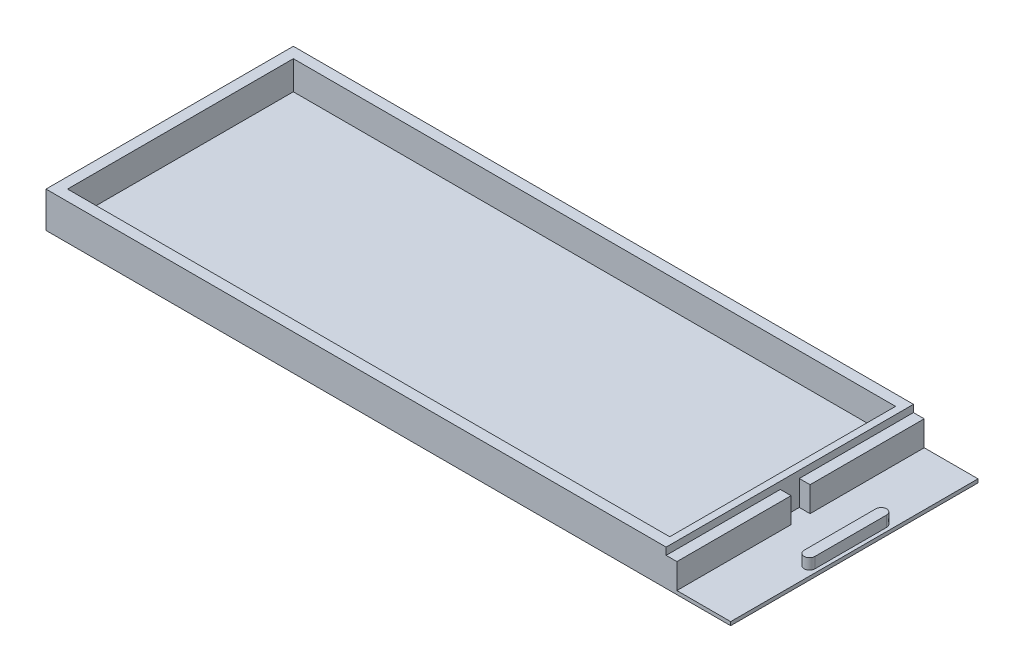
ISO-10303-21;
HEADER;
FILE_DESCRIPTION(('STEP AP214'),'2;1');
FILE_NAME('part.step','',(''),(''),'','','');
FILE_SCHEMA(('AUTOMOTIVE_DESIGN { 1 0 10303 214 1 1 1 1 }'));
ENDSEC;
DATA;
#1=APPLICATION_CONTEXT('core data for automotive mechanical design processes');
#2=APPLICATION_PROTOCOL_DEFINITION('international standard','automotive_design',2000,#1);
#3=PRODUCT_CONTEXT('',#1,'mechanical');
#4=PRODUCT('Part','Part','',(#3));
#5=PRODUCT_RELATED_PRODUCT_CATEGORY('part','',(#4));
#6=PRODUCT_DEFINITION_FORMATION('','',#4);
#7=PRODUCT_DEFINITION_CONTEXT('part definition',#1,'design');
#8=PRODUCT_DEFINITION('design','',#6,#7);
#9=PRODUCT_DEFINITION_SHAPE('','',#8);
#10=(LENGTH_UNIT() NAMED_UNIT(*) SI_UNIT(.MILLI.,.METRE.));
#11=(NAMED_UNIT(*) PLANE_ANGLE_UNIT() SI_UNIT($,.RADIAN.));
#12=(NAMED_UNIT(*) SI_UNIT($,.STERADIAN.) SOLID_ANGLE_UNIT());
#13=UNCERTAINTY_MEASURE_WITH_UNIT(LENGTH_MEASURE(1.E-05),#10,'distance_accuracy_value','');
#14=(GEOMETRIC_REPRESENTATION_CONTEXT(3) GLOBAL_UNCERTAINTY_ASSIGNED_CONTEXT((#13)) GLOBAL_UNIT_ASSIGNED_CONTEXT((#10,
#11,#12)) REPRESENTATION_CONTEXT('',''));
#15=CARTESIAN_POINT('',(0.,0.,0.));
#16=DIRECTION('',(0.,0.,1.));
#17=DIRECTION('',(1.,0.,0.));
#18=AXIS2_PLACEMENT_3D('',#15,#16,#17);
#19=CARTESIAN_POINT('',(104.,1.,34.5));
#20=DIRECTION('',(0.,-1.,0.));
#21=DIRECTION('',(0.,0.,-1.));
#22=AXIS2_PLACEMENT_3D('',#19,#20,#21);
#23=PLANE('',#22);
#24=DIRECTION('',(0.,0.,1.));
#25=VECTOR('',#24,1.);
#26=CARTESIAN_POINT('',(89.,1.,34.5));
#27=LINE('',#26,#25);
#28=CARTESIAN_POINT('',(89.,1.,-34.5));
#29=VERTEX_POINT('',#28);
#30=CARTESIAN_POINT('',(89.,1.,-2.65000000000001));
#31=VERTEX_POINT('',#30);
#32=EDGE_CURVE('E303',#29,#31,#27,.T.);
#33=ORIENTED_EDGE('',*,*,#32,.T.);
#34=DIRECTION('',(1.,0.,0.));
#35=VECTOR('',#34,1.);
#36=CARTESIAN_POINT('',(86.,1.,-2.65000000000001));
#37=LINE('',#36,#35);
#38=CARTESIAN_POINT('',(86.,1.,-2.65000000000001));
#39=VERTEX_POINT('',#38);
#40=EDGE_CURVE('E256',#39,#31,#37,.T.);
#41=ORIENTED_EDGE('',*,*,#40,.F.);
#42=DIRECTION('',(0.,0.,-1.));
#43=VECTOR('',#42,1.);
#44=CARTESIAN_POINT('',(86.,1.,2.65));
#45=LINE('',#44,#43);
#46=CARTESIAN_POINT('',(86.,1.,2.65));
#47=VERTEX_POINT('',#46);
#48=EDGE_CURVE('E248',#47,#39,#45,.T.);
#49=ORIENTED_EDGE('',*,*,#48,.F.);
#50=DIRECTION('',(1.,0.,0.));
#51=VECTOR('',#50,1.);
#52=CARTESIAN_POINT('',(86.,1.,2.65));
#53=LINE('',#52,#51);
#54=CARTESIAN_POINT('',(89.,1.,2.65));
#55=VERTEX_POINT('',#54);
#56=EDGE_CURVE('E260',#47,#55,#53,.T.);
#57=ORIENTED_EDGE('',*,*,#56,.T.);
#58=CARTESIAN_POINT('',(89.,1.,34.5));
#59=VERTEX_POINT('',#58);
#60=EDGE_CURVE('E289',#55,#59,#27,.T.);
#61=ORIENTED_EDGE('',*,*,#60,.T.);
#62=DIRECTION('',(-1.,0.,0.));
#63=VECTOR('',#62,1.);
#64=CARTESIAN_POINT('',(104.,1.,34.5));
#65=LINE('',#64,#63);
#66=CARTESIAN_POINT('',(104.,1.,34.5));
#67=VERTEX_POINT('',#66);
#68=EDGE_CURVE('E313',#67,#59,#65,.T.);
#69=ORIENTED_EDGE('',*,*,#68,.F.);
#70=DIRECTION('',(0.,0.,1.));
#71=VECTOR('',#70,1.);
#72=CARTESIAN_POINT('',(104.,1.,34.5));
#73=LINE('',#72,#71);
#74=CARTESIAN_POINT('',(104.,1.,-34.5));
#75=VERTEX_POINT('',#74);
#76=EDGE_CURVE('E306',#75,#67,#73,.T.);
#77=ORIENTED_EDGE('',*,*,#76,.F.);
#78=DIRECTION('',(-1.,0.,0.));
#79=VECTOR('',#78,1.);
#80=CARTESIAN_POINT('',(104.,1.,-34.5));
#81=LINE('',#80,#79);
#82=EDGE_CURVE('E320',#75,#29,#81,.T.);
#83=ORIENTED_EDGE('',*,*,#82,.T.);
#84=EDGE_LOOP('',(#33,#41,#49,#57,#61,#69,#77,#83));
#85=FACE_BOUND('',#84,.T.);
#86=CARTESIAN_POINT('',(101.5,1.,-10.));
#87=DIRECTION('',(0.,1.,0.));
#88=DIRECTION('',(0.,0.,1.));
#89=AXIS2_PLACEMENT_3D('',#86,#87,#88);
#90=CIRCLE('',#89,1.50000000000002);
#91=CARTESIAN_POINT('',(103.,1.,-10.));
#92=VERTEX_POINT('',#91);
#93=CARTESIAN_POINT('',(100.,1.,-9.99999999999999));
#94=VERTEX_POINT('',#93);
#95=EDGE_CURVE('E229',#92,#94,#90,.T.);
#96=ORIENTED_EDGE('',*,*,#95,.F.);
#97=DIRECTION('',(0.,0.,-1.));
#98=VECTOR('',#97,1.);
#99=CARTESIAN_POINT('',(103.,1.,-10.));
#100=LINE('',#99,#98);
#101=CARTESIAN_POINT('',(103.,1.,10.));
#102=VERTEX_POINT('',#101);
#103=EDGE_CURVE('E226',#102,#92,#100,.T.);
#104=ORIENTED_EDGE('',*,*,#103,.F.);
#105=CARTESIAN_POINT('',(101.5,1.,10.));
#106=DIRECTION('',(0.,1.,0.));
#107=DIRECTION('',(0.,0.,1.));
#108=AXIS2_PLACEMENT_3D('',#105,#106,#107);
#109=CIRCLE('',#108,1.50000000000002);
#110=CARTESIAN_POINT('',(100.,1.,10.));
#111=VERTEX_POINT('',#110);
#112=EDGE_CURVE('E66',#111,#102,#109,.T.);
#113=ORIENTED_EDGE('',*,*,#112,.F.);
#114=DIRECTION('',(0.,0.,1.));
#115=VECTOR('',#114,1.);
#116=CARTESIAN_POINT('',(100.,1.,-10.));
#117=LINE('',#116,#115);
#118=EDGE_CURVE('E61',#94,#111,#117,.T.);
#119=ORIENTED_EDGE('',*,*,#118,.F.);
#120=EDGE_LOOP('',(#96,#104,#113,#119));
#121=FACE_BOUND('',#120,.T.);
#122=ADVANCED_FACE('F45',(#85,#121),#23,.F.);
#123=CARTESIAN_POINT('',(89.,0.,-6.5));
#124=DIRECTION('',(-1.,0.,0.));
#125=DIRECTION('',(0.,0.,1.));
#126=AXIS2_PLACEMENT_3D('',#123,#124,#125);
#127=PLANE('',#126);
#128=DIRECTION('',(0.,0.,1.));
#129=VECTOR('',#128,1.);
#130=CARTESIAN_POINT('',(89.,8.,-34.5));
#131=LINE('',#130,#129);
#132=CARTESIAN_POINT('',(89.,8.,-34.5));
#133=VERTEX_POINT('',#132);
#134=CARTESIAN_POINT('',(89.,7.99999999999999,-2.65));
#135=VERTEX_POINT('',#134);
#136=EDGE_CURVE('E285',#133,#135,#131,.T.);
#137=ORIENTED_EDGE('',*,*,#136,.T.);
#138=DIRECTION('',(0.,1.,0.));
#139=VECTOR('',#138,1.);
#140=CARTESIAN_POINT('',(89.,1.,-2.65000000000001));
#141=LINE('',#140,#139);
#142=EDGE_CURVE('E231',#31,#135,#141,.T.);
#143=ORIENTED_EDGE('',*,*,#142,.F.);
#144=ORIENTED_EDGE('',*,*,#32,.F.);
#145=DIRECTION('',(0.,1.,0.));
#146=VECTOR('',#145,1.);
#147=CARTESIAN_POINT('',(89.,8.,-34.5));
#148=LINE('',#147,#146);
#149=EDGE_CURVE('E365',#29,#133,#148,.T.);
#150=ORIENTED_EDGE('',*,*,#149,.T.);
#151=EDGE_LOOP('',(#137,#143,#144,#150));
#152=FACE_BOUND('',#151,.T.);
#153=ADVANCED_FACE('F505',(#152),#127,.F.);
#154=CARTESIAN_POINT('',(89.,8.,-34.5));
#155=DIRECTION('',(0.,-1.,0.));
#156=DIRECTION('',(0.,0.,-1.));
#157=AXIS2_PLACEMENT_3D('',#154,#155,#156);
#158=PLANE('',#157);
#159=DIRECTION('',(0.,0.,1.));
#160=VECTOR('',#159,1.);
#161=CARTESIAN_POINT('',(86.,8.,-34.5));
#162=LINE('',#161,#160);
#163=CARTESIAN_POINT('',(86.,8.,-34.5));
#164=VERTEX_POINT('',#163);
#165=CARTESIAN_POINT('',(86.,8.,-2.65));
#166=VERTEX_POINT('',#165);
#167=EDGE_CURVE('E291',#164,#166,#162,.T.);
#168=ORIENTED_EDGE('',*,*,#167,.T.);
#169=DIRECTION('',(1.,0.,0.));
#170=VECTOR('',#169,1.);
#171=CARTESIAN_POINT('',(86.,7.99999999999999,-2.65));
#172=LINE('',#171,#170);
#173=EDGE_CURVE('E251',#166,#135,#172,.T.);
#174=ORIENTED_EDGE('',*,*,#173,.T.);
#175=ORIENTED_EDGE('',*,*,#136,.F.);
#176=DIRECTION('',(1.,0.,0.));
#177=VECTOR('',#176,1.);
#178=CARTESIAN_POINT('',(89.,8.,-34.5));
#179=LINE('',#178,#177);
#180=EDGE_CURVE('E273',#164,#133,#179,.T.);
#181=ORIENTED_EDGE('',*,*,#180,.F.);
#182=EDGE_LOOP('',(#168,#174,#175,#181));
#183=FACE_BOUND('',#182,.T.);
#184=ADVANCED_FACE('F511',(#183),#158,.F.);
#185=ORIENTED_EDGE('',*,*,#60,.F.);
#186=DIRECTION('',(0.,-1.,0.));
#187=VECTOR('',#186,1.);
#188=CARTESIAN_POINT('',(89.,7.99999999999999,2.65));
#189=LINE('',#188,#187);
#190=CARTESIAN_POINT('',(89.,7.99999999999999,2.65));
#191=VERTEX_POINT('',#190);
#192=EDGE_CURVE('E235',#191,#55,#189,.T.);
#193=ORIENTED_EDGE('',*,*,#192,.F.);
#194=CARTESIAN_POINT('',(89.,8.,34.5));
#195=VERTEX_POINT('',#194);
#196=EDGE_CURVE('E290',#191,#195,#131,.T.);
#197=ORIENTED_EDGE('',*,*,#196,.T.);
#198=DIRECTION('',(0.,1.,0.));
#199=VECTOR('',#198,1.);
#200=CARTESIAN_POINT('',(89.,8.,34.5));
#201=LINE('',#200,#199);
#202=EDGE_CURVE('E369',#59,#195,#201,.T.);
#203=ORIENTED_EDGE('',*,*,#202,.F.);
#204=EDGE_LOOP('',(#185,#193,#197,#203));
#205=FACE_BOUND('',#204,.T.);
#206=ADVANCED_FACE('F465',(#205),#127,.F.);
#207=CARTESIAN_POINT('',(-87.,10.,-34.5));
#208=DIRECTION('',(1.,0.,0.));
#209=DIRECTION('',(0.,0.,-1.));
#210=AXIS2_PLACEMENT_3D('',#207,#208,#209);
#211=PLANE('',#210);
#212=DIRECTION('',(0.,-1.,0.));
#213=VECTOR('',#212,1.);
#214=CARTESIAN_POINT('',(-87.,0.,-5.));
#215=LINE('',#214,#213);
#216=CARTESIAN_POINT('',(-87.,5.,-5.));
#217=VERTEX_POINT('',#216);
#218=CARTESIAN_POINT('',(-87.,0.,-5.));
#219=VERTEX_POINT('',#218);
#220=EDGE_CURVE('E324',#217,#219,#215,.T.);
#221=ORIENTED_EDGE('',*,*,#220,.F.);
#222=DIRECTION('',(0.,0.,-1.));
#223=VECTOR('',#222,1.);
#224=CARTESIAN_POINT('',(-87.,5.,-5.));
#225=LINE('',#224,#223);
#226=CARTESIAN_POINT('',(-87.,5.,5.));
#227=VERTEX_POINT('',#226);
#228=EDGE_CURVE('E330',#227,#217,#225,.T.);
#229=ORIENTED_EDGE('',*,*,#228,.F.);
#230=DIRECTION('',(0.,1.,0.));
#231=VECTOR('',#230,1.);
#232=CARTESIAN_POINT('',(-87.,5.,5.));
#233=LINE('',#232,#231);
#234=CARTESIAN_POINT('',(-87.,0.,5.));
#235=VERTEX_POINT('',#234);
#236=EDGE_CURVE('E343',#235,#227,#233,.T.);
#237=ORIENTED_EDGE('',*,*,#236,.F.);
#238=DIRECTION('',(0.,0.,1.));
#239=VECTOR('',#238,1.);
#240=CARTESIAN_POINT('',(-87.,0.,-34.5));
#241=LINE('',#240,#239);
#242=CARTESIAN_POINT('',(-87.,0.,34.5));
#243=VERTEX_POINT('',#242);
#244=EDGE_CURVE('E414',#235,#243,#241,.T.);
#245=ORIENTED_EDGE('',*,*,#244,.T.);
#246=DIRECTION('',(0.,-1.,0.));
#247=VECTOR('',#246,1.);
#248=CARTESIAN_POINT('',(-87.,10.,34.5));
#249=LINE('',#248,#247);
#250=CARTESIAN_POINT('',(-87.,10.,34.5));
#251=VERTEX_POINT('',#250);
#252=EDGE_CURVE('E54',#251,#243,#249,.T.);
#253=ORIENTED_EDGE('',*,*,#252,.F.);
#254=DIRECTION('',(0.,0.,1.));
#255=VECTOR('',#254,1.);
#256=CARTESIAN_POINT('',(-87.,10.,-34.5));
#257=LINE('',#256,#255);
#258=CARTESIAN_POINT('',(-87.,10.,-34.5));
#259=VERTEX_POINT('',#258);
#260=EDGE_CURVE('E418',#259,#251,#257,.T.);
#261=ORIENTED_EDGE('',*,*,#260,.F.);
#262=DIRECTION('',(0.,-1.,0.));
#263=VECTOR('',#262,1.);
#264=CARTESIAN_POINT('',(-87.,10.,-34.5));
#265=LINE('',#264,#263);
#266=CARTESIAN_POINT('',(-87.,0.,-34.5));
#267=VERTEX_POINT('',#266);
#268=EDGE_CURVE('E11',#259,#267,#265,.T.);
#269=ORIENTED_EDGE('',*,*,#268,.T.);
#270=EDGE_CURVE('E426',#267,#219,#241,.T.);
#271=ORIENTED_EDGE('',*,*,#270,.T.);
#272=EDGE_LOOP('',(#221,#229,#237,#245,#253,#261,#269,#271));
#273=FACE_BOUND('',#272,.T.);
#274=ADVANCED_FACE('F47',(#273),#211,.F.);
#275=CARTESIAN_POINT('',(0.,0.,0.));
#276=DIRECTION('',(0.,-1.,0.));
#277=DIRECTION('',(0.,0.,-1.));
#278=AXIS2_PLACEMENT_3D('',#275,#276,#277);
#279=PLANE('',#278);
#280=DIRECTION('',(-1.,0.,0.));
#281=VECTOR('',#280,1.);
#282=CARTESIAN_POINT('',(84.,0.,-34.5));
#283=LINE('',#282,#281);
#284=CARTESIAN_POINT('',(104.,0.,-34.5));
#285=VERTEX_POINT('',#284);
#286=EDGE_CURVE('E419',#285,#267,#283,.T.);
#287=ORIENTED_EDGE('',*,*,#286,.F.);
#288=DIRECTION('',(0.,0.,-1.));
#289=VECTOR('',#288,1.);
#290=CARTESIAN_POINT('',(104.,0.,-34.5));
#291=LINE('',#290,#289);
#292=CARTESIAN_POINT('',(104.,0.,34.5));
#293=VERTEX_POINT('',#292);
#294=EDGE_CURVE('E298',#293,#285,#291,.T.);
#295=ORIENTED_EDGE('',*,*,#294,.F.);
#296=DIRECTION('',(1.,0.,0.));
#297=VECTOR('',#296,1.);
#298=CARTESIAN_POINT('',(84.,0.,34.5));
#299=LINE('',#298,#297);
#300=EDGE_CURVE('E429',#243,#293,#299,.T.);
#301=ORIENTED_EDGE('',*,*,#300,.F.);
#302=ORIENTED_EDGE('',*,*,#244,.F.);
#303=DIRECTION('',(1.,0.,0.));
#304=VECTOR('',#303,1.);
#305=CARTESIAN_POINT('',(-90.,0.,5.));
#306=LINE('',#305,#304);
#307=CARTESIAN_POINT('',(-90.,0.,5.));
#308=VERTEX_POINT('',#307);
#309=EDGE_CURVE('E357',#308,#235,#306,.T.);
#310=ORIENTED_EDGE('',*,*,#309,.F.);
#311=DIRECTION('',(0.,0.,1.));
#312=VECTOR('',#311,1.);
#313=CARTESIAN_POINT('',(-90.,0.,5.));
#314=LINE('',#313,#312);
#315=CARTESIAN_POINT('',(-90.,0.,-5.));
#316=VERTEX_POINT('',#315);
#317=EDGE_CURVE('E329',#316,#308,#314,.T.);
#318=ORIENTED_EDGE('',*,*,#317,.F.);
#319=DIRECTION('',(1.,0.,0.));
#320=VECTOR('',#319,1.);
#321=CARTESIAN_POINT('',(-90.,0.,-5.));
#322=LINE('',#321,#320);
#323=EDGE_CURVE('E361',#316,#219,#322,.T.);
#324=ORIENTED_EDGE('',*,*,#323,.T.);
#325=ORIENTED_EDGE('',*,*,#270,.F.);
#326=EDGE_LOOP('',(#287,#295,#301,#302,#310,#318,#324,#325));
#327=FACE_BOUND('',#326,.T.);
#328=ADVANCED_FACE('F449',(#327),#279,.T.);
#329=CARTESIAN_POINT('',(84.,10.,34.5));
#330=DIRECTION('',(0.,0.,-1.));
#331=DIRECTION('',(-1.,0.,0.));
#332=AXIS2_PLACEMENT_3D('',#329,#330,#331);
#333=PLANE('',#332);
#334=ORIENTED_EDGE('',*,*,#202,.T.);
#335=DIRECTION('',(1.,0.,0.));
#336=VECTOR('',#335,1.);
#337=CARTESIAN_POINT('',(89.,8.,34.5));
#338=LINE('',#337,#336);
#339=CARTESIAN_POINT('',(86.,8.,34.5));
#340=VERTEX_POINT('',#339);
#341=EDGE_CURVE('E274',#340,#195,#338,.T.);
#342=ORIENTED_EDGE('',*,*,#341,.F.);
#343=DIRECTION('',(0.,-1.,0.));
#344=VECTOR('',#343,1.);
#345=CARTESIAN_POINT('',(86.,10.,34.5));
#346=LINE('',#345,#344);
#347=CARTESIAN_POINT('',(86.,10.,34.5));
#348=VERTEX_POINT('',#347);
#349=EDGE_CURVE('E259',#348,#340,#346,.T.);
#350=ORIENTED_EDGE('',*,*,#349,.F.);
#351=DIRECTION('',(1.,0.,0.));
#352=VECTOR('',#351,1.);
#353=CARTESIAN_POINT('',(-87.,10.,34.5));
#354=LINE('',#353,#352);
#355=EDGE_CURVE('E422',#251,#348,#354,.T.);
#356=ORIENTED_EDGE('',*,*,#355,.F.);
#357=ORIENTED_EDGE('',*,*,#252,.T.);
#358=ORIENTED_EDGE('',*,*,#300,.T.);
#359=DIRECTION('',(0.,-1.,0.));
#360=VECTOR('',#359,1.);
#361=CARTESIAN_POINT('',(104.,0.,34.5));
#362=LINE('',#361,#360);
#363=EDGE_CURVE('E309',#67,#293,#362,.T.);
#364=ORIENTED_EDGE('',*,*,#363,.F.);
#365=ORIENTED_EDGE('',*,*,#68,.T.);
#366=EDGE_LOOP('',(#334,#342,#350,#356,#357,#358,#364,#365));
#367=FACE_BOUND('',#366,.T.);
#368=ADVANCED_FACE('F438',(#367),#333,.F.);
#369=CARTESIAN_POINT('',(0.,10.,0.));
#370=DIRECTION('',(0.,-1.,0.));
#371=DIRECTION('',(0.,0.,-1.));
#372=AXIS2_PLACEMENT_3D('',#369,#370,#371);
#373=PLANE('',#372);
#374=DIRECTION('',(0.,0.,-1.));
#375=VECTOR('',#374,1.);
#376=CARTESIAN_POINT('',(84.,10.,31.5));
#377=LINE('',#376,#375);
#378=CARTESIAN_POINT('',(84.,10.,31.5));
#379=VERTEX_POINT('',#378);
#380=CARTESIAN_POINT('',(84.,10.,-31.5));
#381=VERTEX_POINT('',#380);
#382=EDGE_CURVE('E385',#379,#381,#377,.T.);
#383=ORIENTED_EDGE('',*,*,#382,.F.);
#384=DIRECTION('',(1.,0.,0.));
#385=VECTOR('',#384,1.);
#386=CARTESIAN_POINT('',(-84.,10.,31.5));
#387=LINE('',#386,#385);
#388=CARTESIAN_POINT('',(-84.,10.,31.5));
#389=VERTEX_POINT('',#388);
#390=EDGE_CURVE('E395',#389,#379,#387,.T.);
#391=ORIENTED_EDGE('',*,*,#390,.F.);
#392=DIRECTION('',(0.,0.,1.));
#393=VECTOR('',#392,1.);
#394=CARTESIAN_POINT('',(-84.,10.,31.5));
#395=LINE('',#394,#393);
#396=CARTESIAN_POINT('',(-84.,10.,-31.5));
#397=VERTEX_POINT('',#396);
#398=EDGE_CURVE('E391',#397,#389,#395,.T.);
#399=ORIENTED_EDGE('',*,*,#398,.F.);
#400=DIRECTION('',(-1.,0.,0.));
#401=VECTOR('',#400,1.);
#402=CARTESIAN_POINT('',(-84.,10.,-31.5));
#403=LINE('',#402,#401);
#404=EDGE_CURVE('E388',#381,#397,#403,.T.);
#405=ORIENTED_EDGE('',*,*,#404,.F.);
#406=EDGE_LOOP('',(#383,#391,#399,#405));
#407=FACE_BOUND('',#406,.T.);
#408=ORIENTED_EDGE('',*,*,#355,.T.);
#409=DIRECTION('',(0.,0.,1.));
#410=VECTOR('',#409,1.);
#411=CARTESIAN_POINT('',(86.,10.,-34.5));
#412=LINE('',#411,#410);
#413=CARTESIAN_POINT('',(86.,10.,-34.5));
#414=VERTEX_POINT('',#413);
#415=EDGE_CURVE('E278',#414,#348,#412,.T.);
#416=ORIENTED_EDGE('',*,*,#415,.F.);
#417=DIRECTION('',(-1.,0.,0.));
#418=VECTOR('',#417,1.);
#419=CARTESIAN_POINT('',(0.,10.,-34.5));
#420=LINE('',#419,#418);
#421=EDGE_CURVE('E415',#414,#259,#420,.T.);
#422=ORIENTED_EDGE('',*,*,#421,.T.);
#423=ORIENTED_EDGE('',*,*,#260,.T.);
#424=EDGE_LOOP('',(#408,#416,#422,#423));
#425=FACE_BOUND('',#424,.T.);
#426=ADVANCED_FACE('F475',(#407,#425),#373,.F.);
#427=CARTESIAN_POINT('',(84.,10.,31.5));
#428=DIRECTION('',(-1.,0.,0.));
#429=DIRECTION('',(0.,0.,1.));
#430=AXIS2_PLACEMENT_3D('',#427,#428,#429);
#431=PLANE('',#430);
#432=DIRECTION('',(0.,-1.,0.));
#433=VECTOR('',#432,1.);
#434=CARTESIAN_POINT('',(84.,10.,-31.5));
#435=LINE('',#434,#433);
#436=CARTESIAN_POINT('',(84.,2.,-31.5));
#437=VERTEX_POINT('',#436);
#438=EDGE_CURVE('E410',#381,#437,#435,.T.);
#439=ORIENTED_EDGE('',*,*,#438,.T.);
#440=DIRECTION('',(0.,0.,-1.));
#441=VECTOR('',#440,1.);
#442=CARTESIAN_POINT('',(84.,2.,31.5));
#443=LINE('',#442,#441);
#444=CARTESIAN_POINT('',(84.,2.,31.5));
#445=VERTEX_POINT('',#444);
#446=EDGE_CURVE('E373',#445,#437,#443,.T.);
#447=ORIENTED_EDGE('',*,*,#446,.F.);
#448=DIRECTION('',(0.,-1.,0.));
#449=VECTOR('',#448,1.);
#450=CARTESIAN_POINT('',(84.,10.,31.5));
#451=LINE('',#450,#449);
#452=EDGE_CURVE('E398',#379,#445,#451,.T.);
#453=ORIENTED_EDGE('',*,*,#452,.F.);
#454=ORIENTED_EDGE('',*,*,#382,.T.);
#455=EDGE_LOOP('',(#439,#447,#453,#454));
#456=FACE_BOUND('',#455,.T.);
#457=ADVANCED_FACE('F684',(#456),#431,.T.);
#458=CARTESIAN_POINT('',(-84.,10.,-31.5));
#459=DIRECTION('',(0.,0.,1.));
#460=DIRECTION('',(1.,0.,0.));
#461=AXIS2_PLACEMENT_3D('',#458,#459,#460);
#462=PLANE('',#461);
#463=DIRECTION('',(0.,-1.,0.));
#464=VECTOR('',#463,1.);
#465=CARTESIAN_POINT('',(-84.,10.,-31.5));
#466=LINE('',#465,#464);
#467=CARTESIAN_POINT('',(-84.,2.,-31.5));
#468=VERTEX_POINT('',#467);
#469=EDGE_CURVE('E406',#397,#468,#466,.T.);
#470=ORIENTED_EDGE('',*,*,#469,.T.);
#471=DIRECTION('',(-1.,0.,0.));
#472=VECTOR('',#471,1.);
#473=CARTESIAN_POINT('',(-84.,2.,-31.5));
#474=LINE('',#473,#472);
#475=EDGE_CURVE('E376',#437,#468,#474,.T.);
#476=ORIENTED_EDGE('',*,*,#475,.F.);
#477=ORIENTED_EDGE('',*,*,#438,.F.);
#478=ORIENTED_EDGE('',*,*,#404,.T.);
#479=EDGE_LOOP('',(#470,#476,#477,#478));
#480=FACE_BOUND('',#479,.T.);
#481=ADVANCED_FACE('F702',(#480),#462,.T.);
#482=CARTESIAN_POINT('',(-84.,10.,31.5));
#483=DIRECTION('',(1.,0.,0.));
#484=DIRECTION('',(0.,0.,-1.));
#485=AXIS2_PLACEMENT_3D('',#482,#483,#484);
#486=PLANE('',#485);
#487=DIRECTION('',(0.,-1.,0.));
#488=VECTOR('',#487,1.);
#489=CARTESIAN_POINT('',(-84.,10.,31.5));
#490=LINE('',#489,#488);
#491=CARTESIAN_POINT('',(-84.,2.,31.5));
#492=VERTEX_POINT('',#491);
#493=EDGE_CURVE('E402',#389,#492,#490,.T.);
#494=ORIENTED_EDGE('',*,*,#493,.T.);
#495=DIRECTION('',(0.,0.,1.));
#496=VECTOR('',#495,1.);
#497=CARTESIAN_POINT('',(-84.,2.,31.5));
#498=LINE('',#497,#496);
#499=EDGE_CURVE('E379',#468,#492,#498,.T.);
#500=ORIENTED_EDGE('',*,*,#499,.F.);
#501=ORIENTED_EDGE('',*,*,#469,.F.);
#502=ORIENTED_EDGE('',*,*,#398,.T.);
#503=EDGE_LOOP('',(#494,#500,#501,#502));
#504=FACE_BOUND('',#503,.T.);
#505=ADVANCED_FACE('F712',(#504),#486,.T.);
#506=CARTESIAN_POINT('',(-84.,10.,31.5));
#507=DIRECTION('',(0.,0.,-1.));
#508=DIRECTION('',(-1.,0.,0.));
#509=AXIS2_PLACEMENT_3D('',#506,#507,#508);
#510=PLANE('',#509);
#511=ORIENTED_EDGE('',*,*,#452,.T.);
#512=DIRECTION('',(1.,0.,0.));
#513=VECTOR('',#512,1.);
#514=CARTESIAN_POINT('',(-84.,2.,31.5));
#515=LINE('',#514,#513);
#516=EDGE_CURVE('E382',#492,#445,#515,.T.);
#517=ORIENTED_EDGE('',*,*,#516,.F.);
#518=ORIENTED_EDGE('',*,*,#493,.F.);
#519=ORIENTED_EDGE('',*,*,#390,.T.);
#520=EDGE_LOOP('',(#511,#517,#518,#519));
#521=FACE_BOUND('',#520,.T.);
#522=ADVANCED_FACE('F722',(#521),#510,.T.);
#523=CARTESIAN_POINT('',(84.,10.,-34.5));
#524=DIRECTION('',(0.,0.,1.));
#525=DIRECTION('',(1.,0.,0.));
#526=AXIS2_PLACEMENT_3D('',#523,#524,#525);
#527=PLANE('',#526);
#528=DIRECTION('',(0.,-1.,0.));
#529=VECTOR('',#528,1.);
#530=CARTESIAN_POINT('',(86.,10.,-34.5));
#531=LINE('',#530,#529);
#532=EDGE_CURVE('E269',#414,#164,#531,.T.);
#533=ORIENTED_EDGE('',*,*,#532,.T.);
#534=ORIENTED_EDGE('',*,*,#180,.T.);
#535=ORIENTED_EDGE('',*,*,#149,.F.);
#536=ORIENTED_EDGE('',*,*,#82,.F.);
#537=DIRECTION('',(0.,1.,0.));
#538=VECTOR('',#537,1.);
#539=CARTESIAN_POINT('',(104.,1.,-34.5));
#540=LINE('',#539,#538);
#541=EDGE_CURVE('E302',#285,#75,#540,.T.);
#542=ORIENTED_EDGE('',*,*,#541,.F.);
#543=ORIENTED_EDGE('',*,*,#286,.T.);
#544=ORIENTED_EDGE('',*,*,#268,.F.);
#545=ORIENTED_EDGE('',*,*,#421,.F.);
#546=EDGE_LOOP('',(#533,#534,#535,#536,#542,#543,#544,#545));
#547=FACE_BOUND('',#546,.T.);
#548=ADVANCED_FACE('F479',(#547),#527,.F.);
#549=CARTESIAN_POINT('',(0.,2.,0.));
#550=DIRECTION('',(0.,-1.,0.));
#551=DIRECTION('',(0.,0.,-1.));
#552=AXIS2_PLACEMENT_3D('',#549,#550,#551);
#553=PLANE('',#552);
#554=ORIENTED_EDGE('',*,*,#446,.T.);
#555=ORIENTED_EDGE('',*,*,#475,.T.);
#556=ORIENTED_EDGE('',*,*,#499,.T.);
#557=ORIENTED_EDGE('',*,*,#516,.T.);
#558=EDGE_LOOP('',(#554,#555,#556,#557));
#559=FACE_BOUND('',#558,.T.);
#560=ADVANCED_FACE('F644',(#559),#553,.F.);
#561=CARTESIAN_POINT('',(-90.,0.,-5.));
#562=DIRECTION('',(0.,0.,1.));
#563=DIRECTION('',(1.,0.,0.));
#564=AXIS2_PLACEMENT_3D('',#561,#562,#563);
#565=PLANE('',#564);
#566=ORIENTED_EDGE('',*,*,#220,.T.);
#567=ORIENTED_EDGE('',*,*,#323,.F.);
#568=DIRECTION('',(0.,-1.,0.));
#569=VECTOR('',#568,1.);
#570=CARTESIAN_POINT('',(-90.,0.,-5.));
#571=LINE('',#570,#569);
#572=CARTESIAN_POINT('',(-90.,5.,-5.));
#573=VERTEX_POINT('',#572);
#574=EDGE_CURVE('E325',#573,#316,#571,.T.);
#575=ORIENTED_EDGE('',*,*,#574,.F.);
#576=DIRECTION('',(1.,0.,0.));
#577=VECTOR('',#576,1.);
#578=CARTESIAN_POINT('',(-90.,5.,-5.));
#579=LINE('',#578,#577);
#580=EDGE_CURVE('E339',#573,#217,#579,.T.);
#581=ORIENTED_EDGE('',*,*,#580,.T.);
#582=EDGE_LOOP('',(#566,#567,#575,#581));
#583=FACE_BOUND('',#582,.T.);
#584=ADVANCED_FACE('F483',(#583),#565,.F.);
#585=CARTESIAN_POINT('',(-90.,5.,5.));
#586=DIRECTION('',(0.,0.,-1.));
#587=DIRECTION('',(0.,1.,0.));
#588=AXIS2_PLACEMENT_3D('',#585,#586,#587);
#589=PLANE('',#588);
#590=ORIENTED_EDGE('',*,*,#236,.T.);
#591=DIRECTION('',(1.,0.,0.));
#592=VECTOR('',#591,1.);
#593=CARTESIAN_POINT('',(-90.,5.,5.));
#594=LINE('',#593,#592);
#595=CARTESIAN_POINT('',(-90.,5.,5.));
#596=VERTEX_POINT('',#595);
#597=EDGE_CURVE('E353',#596,#227,#594,.T.);
#598=ORIENTED_EDGE('',*,*,#597,.F.);
#599=DIRECTION('',(0.,1.,0.));
#600=VECTOR('',#599,1.);
#601=CARTESIAN_POINT('',(-90.,5.,5.));
#602=LINE('',#601,#600);
#603=EDGE_CURVE('E333',#308,#596,#602,.T.);
#604=ORIENTED_EDGE('',*,*,#603,.F.);
#605=ORIENTED_EDGE('',*,*,#309,.T.);
#606=EDGE_LOOP('',(#590,#598,#604,#605));
#607=FACE_BOUND('',#606,.T.);
#608=ADVANCED_FACE('F491',(#607),#589,.F.);
#609=CARTESIAN_POINT('',(-90.,5.,-5.));
#610=DIRECTION('',(0.,-1.,0.));
#611=DIRECTION('',(0.,0.,-1.));
#612=AXIS2_PLACEMENT_3D('',#609,#610,#611);
#613=PLANE('',#612);
#614=ORIENTED_EDGE('',*,*,#228,.T.);
#615=ORIENTED_EDGE('',*,*,#580,.F.);
#616=DIRECTION('',(0.,0.,-1.));
#617=VECTOR('',#616,1.);
#618=CARTESIAN_POINT('',(-90.,5.,-5.));
#619=LINE('',#618,#617);
#620=EDGE_CURVE('E336',#596,#573,#619,.T.);
#621=ORIENTED_EDGE('',*,*,#620,.F.);
#622=ORIENTED_EDGE('',*,*,#597,.T.);
#623=EDGE_LOOP('',(#614,#615,#621,#622));
#624=FACE_BOUND('',#623,.T.);
#625=ADVANCED_FACE('F486',(#624),#613,.F.);
#626=CARTESIAN_POINT('',(-90.,0.,0.));
#627=DIRECTION('',(1.,0.,0.));
#628=DIRECTION('',(0.,0.,-1.));
#629=AXIS2_PLACEMENT_3D('',#626,#627,#628);
#630=PLANE('',#629);
#631=ORIENTED_EDGE('',*,*,#574,.T.);
#632=ORIENTED_EDGE('',*,*,#317,.T.);
#633=ORIENTED_EDGE('',*,*,#603,.T.);
#634=ORIENTED_EDGE('',*,*,#620,.T.);
#635=EDGE_LOOP('',(#631,#632,#633,#634));
#636=FACE_BOUND('',#635,.T.);
#637=ADVANCED_FACE('F493',(#636),#630,.F.);
#638=CARTESIAN_POINT('',(104.,0.,0.));
#639=DIRECTION('',(-1.,0.,0.));
#640=DIRECTION('',(0.,0.,1.));
#641=AXIS2_PLACEMENT_3D('',#638,#639,#640);
#642=PLANE('',#641);
#643=ORIENTED_EDGE('',*,*,#294,.T.);
#644=ORIENTED_EDGE('',*,*,#541,.T.);
#645=ORIENTED_EDGE('',*,*,#76,.T.);
#646=ORIENTED_EDGE('',*,*,#363,.T.);
#647=EDGE_LOOP('',(#643,#644,#645,#646));
#648=FACE_BOUND('',#647,.T.);
#649=ADVANCED_FACE('F453',(#648),#642,.F.);
#650=ORIENTED_EDGE('',*,*,#196,.F.);
#651=DIRECTION('',(1.,0.,0.));
#652=VECTOR('',#651,1.);
#653=CARTESIAN_POINT('',(86.,7.99999999999999,2.65));
#654=LINE('',#653,#652);
#655=CARTESIAN_POINT('',(86.,7.99999999999999,2.65));
#656=VERTEX_POINT('',#655);
#657=EDGE_CURVE('E263',#656,#191,#654,.T.);
#658=ORIENTED_EDGE('',*,*,#657,.F.);
#659=EDGE_CURVE('E295',#656,#340,#162,.T.);
#660=ORIENTED_EDGE('',*,*,#659,.T.);
#661=ORIENTED_EDGE('',*,*,#341,.T.);
#662=EDGE_LOOP('',(#650,#658,#660,#661));
#663=FACE_BOUND('',#662,.T.);
#664=ADVANCED_FACE('F470',(#663),#158,.F.);
#665=CARTESIAN_POINT('',(86.,10.,-34.5));
#666=DIRECTION('',(-1.,0.,0.));
#667=DIRECTION('',(0.,0.,1.));
#668=AXIS2_PLACEMENT_3D('',#665,#666,#667);
#669=PLANE('',#668);
#670=ORIENTED_EDGE('',*,*,#349,.T.);
#671=ORIENTED_EDGE('',*,*,#659,.F.);
#672=DIRECTION('',(0.,-1.,0.));
#673=VECTOR('',#672,1.);
#674=CARTESIAN_POINT('',(86.,7.99999999999999,2.65));
#675=LINE('',#674,#673);
#676=EDGE_CURVE('E244',#656,#47,#675,.T.);
#677=ORIENTED_EDGE('',*,*,#676,.T.);
#678=ORIENTED_EDGE('',*,*,#48,.T.);
#679=DIRECTION('',(0.,1.,0.));
#680=VECTOR('',#679,1.);
#681=CARTESIAN_POINT('',(86.,1.,-2.65000000000001));
#682=LINE('',#681,#680);
#683=EDGE_CURVE('E241',#39,#166,#682,.T.);
#684=ORIENTED_EDGE('',*,*,#683,.T.);
#685=ORIENTED_EDGE('',*,*,#167,.F.);
#686=ORIENTED_EDGE('',*,*,#532,.F.);
#687=ORIENTED_EDGE('',*,*,#415,.T.);
#688=EDGE_LOOP('',(#670,#671,#677,#678,#684,#685,#686,#687));
#689=FACE_BOUND('',#688,.T.);
#690=ADVANCED_FACE('F515',(#689),#669,.F.);
#691=CARTESIAN_POINT('',(86.,1.,-2.65000000000001));
#692=DIRECTION('',(0.,0.,-1.));
#693=DIRECTION('',(0.,1.,0.));
#694=AXIS2_PLACEMENT_3D('',#691,#692,#693);
#695=PLANE('',#694);
#696=ORIENTED_EDGE('',*,*,#142,.T.);
#697=ORIENTED_EDGE('',*,*,#173,.F.);
#698=ORIENTED_EDGE('',*,*,#683,.F.);
#699=ORIENTED_EDGE('',*,*,#40,.T.);
#700=EDGE_LOOP('',(#696,#697,#698,#699));
#701=FACE_BOUND('',#700,.T.);
#702=ADVANCED_FACE('F518',(#701),#695,.F.);
#703=CARTESIAN_POINT('',(86.,7.99999999999999,2.65));
#704=DIRECTION('',(0.,0.,1.));
#705=DIRECTION('',(0.,-1.,0.));
#706=AXIS2_PLACEMENT_3D('',#703,#704,#705);
#707=PLANE('',#706);
#708=ORIENTED_EDGE('',*,*,#192,.T.);
#709=ORIENTED_EDGE('',*,*,#56,.F.);
#710=ORIENTED_EDGE('',*,*,#676,.F.);
#711=ORIENTED_EDGE('',*,*,#657,.T.);
#712=EDGE_LOOP('',(#708,#709,#710,#711));
#713=FACE_BOUND('',#712,.T.);
#714=ADVANCED_FACE('F523',(#713),#707,.F.);
#715=CARTESIAN_POINT('',(101.5,4.,-10.));
#716=DIRECTION('',(0.,-1.,0.));
#717=DIRECTION('',(0.,0.,-1.));
#718=AXIS2_PLACEMENT_3D('',#715,#716,#717);
#719=CYLINDRICAL_SURFACE('',#718,1.50000000000002);
#720=ORIENTED_EDGE('',*,*,#95,.T.);
#721=DIRECTION('',(0.,-1.,0.));
#722=VECTOR('',#721,1.);
#723=CARTESIAN_POINT('',(100.,4.,-10.));
#724=LINE('',#723,#722);
#725=CARTESIAN_POINT('',(100.,4.,-10.));
#726=VERTEX_POINT('',#725);
#727=EDGE_CURVE('E208',#726,#94,#724,.T.);
#728=ORIENTED_EDGE('',*,*,#727,.F.);
#729=CARTESIAN_POINT('',(101.5,4.,-10.));
#730=DIRECTION('',(0.,1.,0.));
#731=DIRECTION('',(0.,0.,1.));
#732=AXIS2_PLACEMENT_3D('',#729,#730,#731);
#733=CIRCLE('',#732,1.50000000000002);
#734=CARTESIAN_POINT('',(103.,4.,-10.));
#735=VERTEX_POINT('',#734);
#736=EDGE_CURVE('E216',#735,#726,#733,.T.);
#737=ORIENTED_EDGE('',*,*,#736,.F.);
#738=DIRECTION('',(0.,-1.,0.));
#739=VECTOR('',#738,1.);
#740=CARTESIAN_POINT('',(103.,4.,-10.));
#741=LINE('',#740,#739);
#742=EDGE_CURVE('E829',#735,#92,#741,.T.);
#743=ORIENTED_EDGE('',*,*,#742,.T.);
#744=EDGE_LOOP('',(#720,#728,#737,#743));
#745=FACE_BOUND('',#744,.T.);
#746=ADVANCED_FACE('F228',(#745),#719,.T.);
#747=CARTESIAN_POINT('',(100.,4.,-10.));
#748=DIRECTION('',(1.,0.,0.));
#749=DIRECTION('',(0.,0.,-1.));
#750=AXIS2_PLACEMENT_3D('',#747,#748,#749);
#751=PLANE('',#750);
#752=ORIENTED_EDGE('',*,*,#118,.T.);
#753=DIRECTION('',(0.,-1.,0.));
#754=VECTOR('',#753,1.);
#755=CARTESIAN_POINT('',(100.,4.,10.));
#756=LINE('',#755,#754);
#757=CARTESIAN_POINT('',(100.,4.,10.));
#758=VERTEX_POINT('',#757);
#759=EDGE_CURVE('E211',#758,#111,#756,.T.);
#760=ORIENTED_EDGE('',*,*,#759,.F.);
#761=DIRECTION('',(0.,0.,1.));
#762=VECTOR('',#761,1.);
#763=CARTESIAN_POINT('',(100.,4.,-10.));
#764=LINE('',#763,#762);
#765=EDGE_CURVE('E204',#726,#758,#764,.T.);
#766=ORIENTED_EDGE('',*,*,#765,.F.);
#767=ORIENTED_EDGE('',*,*,#727,.T.);
#768=EDGE_LOOP('',(#752,#760,#766,#767));
#769=FACE_BOUND('',#768,.T.);
#770=ADVANCED_FACE('F206',(#769),#751,.F.);
#771=CARTESIAN_POINT('',(101.5,4.,10.));
#772=DIRECTION('',(0.,-1.,0.));
#773=DIRECTION('',(0.,0.,-1.));
#774=AXIS2_PLACEMENT_3D('',#771,#772,#773);
#775=CYLINDRICAL_SURFACE('',#774,1.50000000000002);
#776=ORIENTED_EDGE('',*,*,#112,.T.);
#777=DIRECTION('',(0.,-1.,0.));
#778=VECTOR('',#777,1.);
#779=CARTESIAN_POINT('',(103.,4.,10.));
#780=LINE('',#779,#778);
#781=CARTESIAN_POINT('',(103.,4.,10.));
#782=VERTEX_POINT('',#781);
#783=EDGE_CURVE('E237',#782,#102,#780,.T.);
#784=ORIENTED_EDGE('',*,*,#783,.F.);
#785=CARTESIAN_POINT('',(101.5,4.,10.));
#786=DIRECTION('',(0.,1.,0.));
#787=DIRECTION('',(0.,0.,1.));
#788=AXIS2_PLACEMENT_3D('',#785,#786,#787);
#789=CIRCLE('',#788,1.50000000000002);
#790=EDGE_CURVE('E215',#758,#782,#789,.T.);
#791=ORIENTED_EDGE('',*,*,#790,.F.);
#792=ORIENTED_EDGE('',*,*,#759,.T.);
#793=EDGE_LOOP('',(#776,#784,#791,#792));
#794=FACE_BOUND('',#793,.T.);
#795=ADVANCED_FACE('F530',(#794),#775,.T.);
#796=CARTESIAN_POINT('',(103.,4.,-10.));
#797=DIRECTION('',(-1.,0.,0.));
#798=DIRECTION('',(0.,0.,1.));
#799=AXIS2_PLACEMENT_3D('',#796,#797,#798);
#800=PLANE('',#799);
#801=ORIENTED_EDGE('',*,*,#103,.T.);
#802=ORIENTED_EDGE('',*,*,#742,.F.);
#803=DIRECTION('',(0.,0.,-1.));
#804=VECTOR('',#803,1.);
#805=CARTESIAN_POINT('',(103.,4.,-10.));
#806=LINE('',#805,#804);
#807=EDGE_CURVE('E221',#782,#735,#806,.T.);
#808=ORIENTED_EDGE('',*,*,#807,.F.);
#809=ORIENTED_EDGE('',*,*,#783,.T.);
#810=EDGE_LOOP('',(#801,#802,#808,#809));
#811=FACE_BOUND('',#810,.T.);
#812=ADVANCED_FACE('F533',(#811),#800,.F.);
#813=CARTESIAN_POINT('',(101.5,4.,-10.));
#814=DIRECTION('',(0.,1.,0.));
#815=DIRECTION('',(0.,0.,1.));
#816=AXIS2_PLACEMENT_3D('',#813,#814,#815);
#817=PLANE('',#816);
#818=ORIENTED_EDGE('',*,*,#736,.T.);
#819=ORIENTED_EDGE('',*,*,#765,.T.);
#820=ORIENTED_EDGE('',*,*,#790,.T.);
#821=ORIENTED_EDGE('',*,*,#807,.T.);
#822=EDGE_LOOP('',(#818,#819,#820,#821));
#823=FACE_BOUND('',#822,.T.);
#824=ADVANCED_FACE('F219',(#823),#817,.T.);
#825=CLOSED_SHELL('',(#122,#153,#184,#206,#274,#328,#368,#426,#457,#481,#505,#522,#548,#560,
#584,#608,#625,#637,#649,#664,#690,#702,#714,#746,#770,#795,#812,#824));
#826=MANIFOLD_SOLID_BREP('B2',#825);
#827=ADVANCED_BREP_SHAPE_REPRESENTATION('',(#18,#826),#14);
#828=SHAPE_DEFINITION_REPRESENTATION(#9,#827);
ENDSEC;
END-ISO-10303-21;
